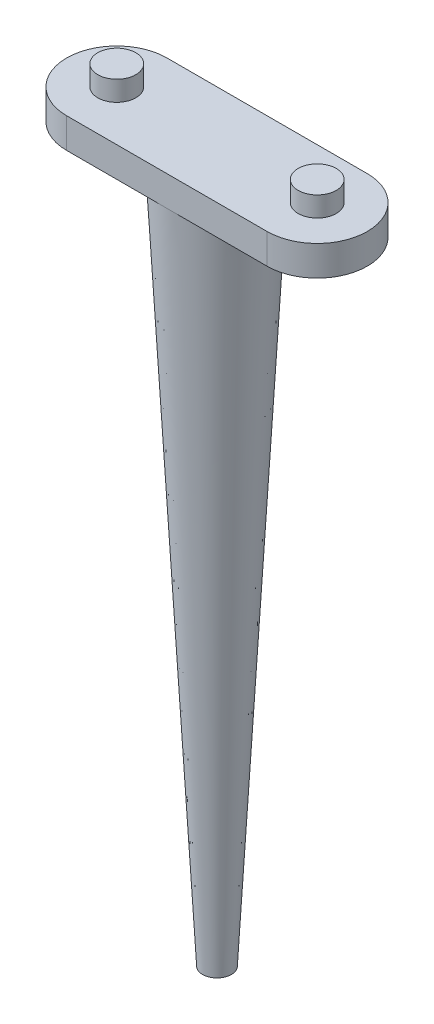
ISO-10303-21;
HEADER;
FILE_DESCRIPTION(('STEP AP214'),'2;1');
FILE_NAME('part.step','',(''),(''),'','','');
FILE_SCHEMA(('AUTOMOTIVE_DESIGN { 1 0 10303 214 1 1 1 1 }'));
ENDSEC;
DATA;
#1=APPLICATION_CONTEXT('core data for automotive mechanical design processes');
#2=APPLICATION_PROTOCOL_DEFINITION('international standard','automotive_design',2000,#1);
#3=PRODUCT_CONTEXT('',#1,'mechanical');
#4=PRODUCT('Part','Part','',(#3));
#5=PRODUCT_RELATED_PRODUCT_CATEGORY('part','',(#4));
#6=PRODUCT_DEFINITION_FORMATION('','',#4);
#7=PRODUCT_DEFINITION_CONTEXT('part definition',#1,'design');
#8=PRODUCT_DEFINITION('design','',#6,#7);
#9=PRODUCT_DEFINITION_SHAPE('','',#8);
#10=(LENGTH_UNIT() NAMED_UNIT(*) SI_UNIT(.MILLI.,.METRE.));
#11=(NAMED_UNIT(*) PLANE_ANGLE_UNIT() SI_UNIT($,.RADIAN.));
#12=(NAMED_UNIT(*) SI_UNIT($,.STERADIAN.) SOLID_ANGLE_UNIT());
#13=UNCERTAINTY_MEASURE_WITH_UNIT(LENGTH_MEASURE(1.E-05),#10,'distance_accuracy_value','');
#14=(GEOMETRIC_REPRESENTATION_CONTEXT(3) GLOBAL_UNCERTAINTY_ASSIGNED_CONTEXT((#13)) GLOBAL_UNIT_ASSIGNED_CONTEXT((#10,
#11,#12)) REPRESENTATION_CONTEXT('',''));
#15=CARTESIAN_POINT('',(0.,0.,0.));
#16=DIRECTION('',(0.,0.,1.));
#17=DIRECTION('',(1.,0.,0.));
#18=AXIS2_PLACEMENT_3D('',#15,#16,#17);
#19=CARTESIAN_POINT('',(-5.,0.,0.));
#20=DIRECTION('',(0.,1.,0.));
#21=DIRECTION('',(0.,0.,1.));
#22=AXIS2_PLACEMENT_3D('',#19,#20,#21);
#23=PLANE('',#22);
#24=CARTESIAN_POINT('',(0.,0.,0.));
#25=DIRECTION('',(0.,-1.,0.));
#26=DIRECTION('',(0.,0.,-1.));
#27=AXIS2_PLACEMENT_3D('',#24,#25,#26);
#28=CIRCLE('',#27,2.5);
#29=CARTESIAN_POINT('',(0.,0.,-2.5));
#30=VERTEX_POINT('',#29);
#31=CARTESIAN_POINT('',(0.,0.,2.5));
#32=VERTEX_POINT('',#31);
#33=EDGE_CURVE('E141',#30,#32,#28,.T.);
#34=ORIENTED_EDGE('',*,*,#33,.F.);
#35=DIRECTION('',(-1.,0.,0.));
#36=VECTOR('',#35,1.);
#37=CARTESIAN_POINT('',(-5.,0.,-2.5));
#38=LINE('',#37,#36);
#39=CARTESIAN_POINT('',(5.,0.,-2.5));
#40=VERTEX_POINT('',#39);
#41=EDGE_CURVE('E126',#40,#30,#38,.T.);
#42=ORIENTED_EDGE('',*,*,#41,.F.);
#43=CARTESIAN_POINT('',(5.,0.,0.));
#44=DIRECTION('',(0.,1.,0.));
#45=DIRECTION('',(0.,0.,1.));
#46=AXIS2_PLACEMENT_3D('',#43,#44,#45);
#47=CIRCLE('',#46,2.5);
#48=CARTESIAN_POINT('',(5.,0.,2.5));
#49=VERTEX_POINT('',#48);
#50=EDGE_CURVE('E143',#49,#40,#47,.T.);
#51=ORIENTED_EDGE('',*,*,#50,.F.);
#52=DIRECTION('',(1.,0.,0.));
#53=VECTOR('',#52,1.);
#54=CARTESIAN_POINT('',(-5.,0.,2.5));
#55=LINE('',#54,#53);
#56=EDGE_CURVE('E145',#32,#49,#55,.T.);
#57=ORIENTED_EDGE('',*,*,#56,.F.);
#58=EDGE_LOOP('',(#34,#42,#51,#57));
#59=FACE_BOUND('',#58,.T.);
#60=ADVANCED_FACE('F37',(#59),#23,.F.);
#61=CARTESIAN_POINT('',(-5.,1.5,0.));
#62=DIRECTION('',(0.,-1.,0.));
#63=DIRECTION('',(0.,0.,-1.));
#64=AXIS2_PLACEMENT_3D('',#61,#62,#63);
#65=CYLINDRICAL_SURFACE('',#64,2.5);
#66=CARTESIAN_POINT('',(-5.,0.,0.));
#67=DIRECTION('',(0.,1.,0.));
#68=DIRECTION('',(0.,0.,1.));
#69=AXIS2_PLACEMENT_3D('',#66,#67,#68);
#70=CIRCLE('',#69,2.5);
#71=CARTESIAN_POINT('',(-5.,0.,-2.5));
#72=VERTEX_POINT('',#71);
#73=CARTESIAN_POINT('',(-5.,0.,2.5));
#74=VERTEX_POINT('',#73);
#75=EDGE_CURVE('E137',#72,#74,#70,.T.);
#76=ORIENTED_EDGE('',*,*,#75,.T.);
#77=DIRECTION('',(0.,-1.,0.));
#78=VECTOR('',#77,1.);
#79=CARTESIAN_POINT('',(-5.,1.5,2.5));
#80=LINE('',#79,#78);
#81=CARTESIAN_POINT('',(-5.,1.5,2.5));
#82=VERTEX_POINT('',#81);
#83=EDGE_CURVE('E151',#82,#74,#80,.T.);
#84=ORIENTED_EDGE('',*,*,#83,.F.);
#85=CARTESIAN_POINT('',(-5.,1.5,0.));
#86=DIRECTION('',(0.,1.,0.));
#87=DIRECTION('',(0.,0.,1.));
#88=AXIS2_PLACEMENT_3D('',#85,#86,#87);
#89=CIRCLE('',#88,2.5);
#90=CARTESIAN_POINT('',(-5.,1.5,-2.5));
#91=VERTEX_POINT('',#90);
#92=EDGE_CURVE('E131',#91,#82,#89,.T.);
#93=ORIENTED_EDGE('',*,*,#92,.F.);
#94=DIRECTION('',(0.,-1.,0.));
#95=VECTOR('',#94,1.);
#96=CARTESIAN_POINT('',(-5.,1.5,-2.5));
#97=LINE('',#96,#95);
#98=EDGE_CURVE('E167',#91,#72,#97,.T.);
#99=ORIENTED_EDGE('',*,*,#98,.T.);
#100=EDGE_LOOP('',(#76,#84,#93,#99));
#101=FACE_BOUND('',#100,.T.);
#102=ADVANCED_FACE('F191',(#101),#65,.T.);
#103=CARTESIAN_POINT('',(-5.,1.5,2.5));
#104=DIRECTION('',(0.,0.,-1.));
#105=DIRECTION('',(-1.,0.,0.));
#106=AXIS2_PLACEMENT_3D('',#103,#104,#105);
#107=PLANE('',#106);
#108=EDGE_CURVE('E169',#74,#32,#55,.T.);
#109=ORIENTED_EDGE('',*,*,#108,.T.);
#110=ORIENTED_EDGE('',*,*,#56,.T.);
#111=DIRECTION('',(0.,-1.,0.));
#112=VECTOR('',#111,1.);
#113=CARTESIAN_POINT('',(5.,1.5,2.5));
#114=LINE('',#113,#112);
#115=CARTESIAN_POINT('',(5.,1.5,2.5));
#116=VERTEX_POINT('',#115);
#117=EDGE_CURVE('E153',#116,#49,#114,.T.);
#118=ORIENTED_EDGE('',*,*,#117,.F.);
#119=DIRECTION('',(1.,0.,0.));
#120=VECTOR('',#119,1.);
#121=CARTESIAN_POINT('',(-5.,1.5,2.5));
#122=LINE('',#121,#120);
#123=EDGE_CURVE('E123',#82,#116,#122,.T.);
#124=ORIENTED_EDGE('',*,*,#123,.F.);
#125=ORIENTED_EDGE('',*,*,#83,.T.);
#126=EDGE_LOOP('',(#109,#110,#118,#124,#125));
#127=FACE_BOUND('',#126,.T.);
#128=ADVANCED_FACE('F319',(#127),#107,.F.);
#129=CARTESIAN_POINT('',(5.,1.5,0.));
#130=DIRECTION('',(0.,-1.,0.));
#131=DIRECTION('',(0.,0.,-1.));
#132=AXIS2_PLACEMENT_3D('',#129,#130,#131);
#133=CYLINDRICAL_SURFACE('',#132,2.5);
#134=ORIENTED_EDGE('',*,*,#50,.T.);
#135=DIRECTION('',(0.,-1.,0.));
#136=VECTOR('',#135,1.);
#137=CARTESIAN_POINT('',(5.,1.5,-2.5));
#138=LINE('',#137,#136);
#139=CARTESIAN_POINT('',(5.,1.5,-2.5));
#140=VERTEX_POINT('',#139);
#141=EDGE_CURVE('E133',#140,#40,#138,.T.);
#142=ORIENTED_EDGE('',*,*,#141,.F.);
#143=CARTESIAN_POINT('',(5.,1.5,0.));
#144=DIRECTION('',(0.,1.,0.));
#145=DIRECTION('',(0.,0.,1.));
#146=AXIS2_PLACEMENT_3D('',#143,#144,#145);
#147=CIRCLE('',#146,2.5);
#148=EDGE_CURVE('E162',#116,#140,#147,.T.);
#149=ORIENTED_EDGE('',*,*,#148,.F.);
#150=ORIENTED_EDGE('',*,*,#117,.T.);
#151=EDGE_LOOP('',(#134,#142,#149,#150));
#152=FACE_BOUND('',#151,.T.);
#153=ADVANCED_FACE('F311',(#152),#133,.T.);
#154=CARTESIAN_POINT('',(-5.,1.5,-2.5));
#155=DIRECTION('',(0.,0.,1.));
#156=DIRECTION('',(1.,0.,0.));
#157=AXIS2_PLACEMENT_3D('',#154,#155,#156);
#158=PLANE('',#157);
#159=ORIENTED_EDGE('',*,*,#41,.T.);
#160=EDGE_CURVE('E118',#30,#72,#38,.T.);
#161=ORIENTED_EDGE('',*,*,#160,.T.);
#162=ORIENTED_EDGE('',*,*,#98,.F.);
#163=DIRECTION('',(-1.,0.,0.));
#164=VECTOR('',#163,1.);
#165=CARTESIAN_POINT('',(-5.,1.5,-2.5));
#166=LINE('',#165,#164);
#167=EDGE_CURVE('E100',#140,#91,#166,.T.);
#168=ORIENTED_EDGE('',*,*,#167,.F.);
#169=ORIENTED_EDGE('',*,*,#141,.T.);
#170=EDGE_LOOP('',(#159,#161,#162,#168,#169));
#171=FACE_BOUND('',#170,.T.);
#172=ADVANCED_FACE('F129',(#171),#158,.F.);
#173=CARTESIAN_POINT('',(-5.,1.5,0.));
#174=DIRECTION('',(0.,1.,0.));
#175=DIRECTION('',(0.,0.,1.));
#176=AXIS2_PLACEMENT_3D('',#173,#174,#175);
#177=PLANE('',#176);
#178=CARTESIAN_POINT('',(-5.,1.5,0.));
#179=DIRECTION('',(0.,1.,0.));
#180=DIRECTION('',(0.,0.,1.));
#181=AXIS2_PLACEMENT_3D('',#178,#179,#180);
#182=CIRCLE('',#181,0.95);
#183=CARTESIAN_POINT('',(-5.,1.5,0.95));
#184=VERTEX_POINT('',#183);
#185=EDGE_CURVE('E11',#184,#184,#182,.T.);
#186=ORIENTED_EDGE('',*,*,#185,.F.);
#187=EDGE_LOOP('',(#186));
#188=FACE_BOUND('',#187,.T.);
#189=CARTESIAN_POINT('',(5.,1.5,0.));
#190=DIRECTION('',(0.,1.,0.));
#191=DIRECTION('',(0.,0.,1.));
#192=AXIS2_PLACEMENT_3D('',#189,#190,#191);
#193=CIRCLE('',#192,0.95);
#194=CARTESIAN_POINT('',(5.,1.5,0.95));
#195=VERTEX_POINT('',#194);
#196=EDGE_CURVE('E60',#195,#195,#193,.T.);
#197=ORIENTED_EDGE('',*,*,#196,.F.);
#198=EDGE_LOOP('',(#197));
#199=FACE_BOUND('',#198,.T.);
#200=ORIENTED_EDGE('',*,*,#92,.T.);
#201=ORIENTED_EDGE('',*,*,#123,.T.);
#202=ORIENTED_EDGE('',*,*,#148,.T.);
#203=ORIENTED_EDGE('',*,*,#167,.T.);
#204=EDGE_LOOP('',(#200,#201,#202,#203));
#205=FACE_BOUND('',#204,.T.);
#206=ADVANCED_FACE('F215',(#188,#199,#205),#177,.T.);
#207=EDGE_CURVE('E86',#32,#30,#28,.T.);
#208=ORIENTED_EDGE('',*,*,#207,.F.);
#209=ORIENTED_EDGE('',*,*,#108,.F.);
#210=ORIENTED_EDGE('',*,*,#75,.F.);
#211=ORIENTED_EDGE('',*,*,#160,.F.);
#212=EDGE_LOOP('',(#208,#209,#210,#211));
#213=FACE_BOUND('',#212,.T.);
#214=ADVANCED_FACE('F140',(#213),#23,.F.);
#215=CARTESIAN_POINT('',(0.,0.,0.));
#216=DIRECTION('',(0.,1.,0.));
#217=DIRECTION('',(0.,0.,-1.));
#218=AXIS2_PLACEMENT_3D('',#215,#216,#217);
#219=CONICAL_SURFACE('',#218,2.5,0.0523598775598299);
#220=CARTESIAN_POINT('',(0.,-34.,0.));
#221=DIRECTION('',(0.,-1.,0.));
#222=DIRECTION('',(0.,0.,-1.));
#223=AXIS2_PLACEMENT_3D('',#220,#221,#222);
#224=CIRCLE('',#223,0.718135504376599);
#225=CARTESIAN_POINT('',(0.,-34.,-0.718135504376599));
#226=VERTEX_POINT('',#225);
#227=EDGE_CURVE('E150',#226,#226,#224,.T.);
#228=ORIENTED_EDGE('',*,*,#227,.F.);
#229=EDGE_LOOP('',(#228));
#230=FACE_BOUND('',#229,.T.);
#231=ORIENTED_EDGE('',*,*,#33,.T.);
#232=ORIENTED_EDGE('',*,*,#207,.T.);
#233=EDGE_LOOP('',(#231,#232));
#234=FACE_BOUND('',#233,.T.);
#235=ADVANCED_FACE('F147',(#230,#234),#219,.T.);
#236=CARTESIAN_POINT('',(0.,-34.,0.));
#237=DIRECTION('',(0.,-1.,0.));
#238=DIRECTION('',(0.,0.,-1.));
#239=AXIS2_PLACEMENT_3D('',#236,#237,#238);
#240=PLANE('',#239);
#241=ORIENTED_EDGE('',*,*,#227,.T.);
#242=EDGE_LOOP('',(#241));
#243=FACE_BOUND('',#242,.T.);
#244=ADVANCED_FACE('F229',(#243),#240,.T.);
#245=CARTESIAN_POINT('',(5.,2.5,0.));
#246=DIRECTION('',(0.,-1.,0.));
#247=DIRECTION('',(0.,0.,-1.));
#248=AXIS2_PLACEMENT_3D('',#245,#246,#247);
#249=CYLINDRICAL_SURFACE('',#248,0.95);
#250=CARTESIAN_POINT('',(5.,2.5,0.));
#251=DIRECTION('',(0.,1.,0.));
#252=DIRECTION('',(0.,0.,1.));
#253=AXIS2_PLACEMENT_3D('',#250,#251,#252);
#254=CIRCLE('',#253,0.95);
#255=CARTESIAN_POINT('',(5.,2.5,0.95));
#256=VERTEX_POINT('',#255);
#257=EDGE_CURVE('E160',#256,#256,#254,.T.);
#258=ORIENTED_EDGE('',*,*,#257,.F.);
#259=EDGE_LOOP('',(#258));
#260=FACE_BOUND('',#259,.T.);
#261=ORIENTED_EDGE('',*,*,#196,.T.);
#262=EDGE_LOOP('',(#261));
#263=FACE_BOUND('',#262,.T.);
#264=ADVANCED_FACE('F224',(#260,#263),#249,.T.);
#265=CARTESIAN_POINT('',(5.,2.5,0.));
#266=DIRECTION('',(0.,1.,0.));
#267=DIRECTION('',(0.,0.,1.));
#268=AXIS2_PLACEMENT_3D('',#265,#266,#267);
#269=PLANE('',#268);
#270=ORIENTED_EDGE('',*,*,#257,.T.);
#271=EDGE_LOOP('',(#270));
#272=FACE_BOUND('',#271,.T.);
#273=ADVANCED_FACE('F228',(#272),#269,.T.);
#274=CARTESIAN_POINT('',(-5.,2.5,0.));
#275=DIRECTION('',(0.,-1.,0.));
#276=DIRECTION('',(0.,0.,-1.));
#277=AXIS2_PLACEMENT_3D('',#274,#275,#276);
#278=CYLINDRICAL_SURFACE('',#277,0.95);
#279=CARTESIAN_POINT('',(-5.,2.5,0.));
#280=DIRECTION('',(0.,1.,0.));
#281=DIRECTION('',(0.,0.,1.));
#282=AXIS2_PLACEMENT_3D('',#279,#280,#281);
#283=CIRCLE('',#282,0.95);
#284=CARTESIAN_POINT('',(-5.,2.5,0.95));
#285=VERTEX_POINT('',#284);
#286=EDGE_CURVE('E146',#285,#285,#283,.T.);
#287=ORIENTED_EDGE('',*,*,#286,.F.);
#288=EDGE_LOOP('',(#287));
#289=FACE_BOUND('',#288,.T.);
#290=ORIENTED_EDGE('',*,*,#185,.T.);
#291=EDGE_LOOP('',(#290));
#292=FACE_BOUND('',#291,.T.);
#293=ADVANCED_FACE('F237',(#289,#292),#278,.T.);
#294=CARTESIAN_POINT('',(-5.,2.5,0.));
#295=DIRECTION('',(0.,1.,0.));
#296=DIRECTION('',(0.,0.,1.));
#297=AXIS2_PLACEMENT_3D('',#294,#295,#296);
#298=PLANE('',#297);
#299=ORIENTED_EDGE('',*,*,#286,.T.);
#300=EDGE_LOOP('',(#299));
#301=FACE_BOUND('',#300,.T.);
#302=ADVANCED_FACE('F241',(#301),#298,.T.);
#303=CLOSED_SHELL('',(#60,#102,#128,#153,#172,#206,#214,#235,#244,#264,#273,#293,#302));
#304=CARTESIAN_POINT('',(-5.,1.5,1.5));
#305=DIRECTION('',(0.,0.,-1.));
#306=DIRECTION('',(-1.,0.,0.));
#307=AXIS2_PLACEMENT_3D('',#304,#305,#306);
#308=PLANE('',#307);
#309=CARTESIAN_POINT('',(0.39460222415233,1.,1.5));
#310=CARTESIAN_POINT('',(0.382554967217705,0.941728306608441,1.5));
#311=CARTESIAN_POINT('',(0.37008946368021,0.883527071336524,1.5));
#312=CARTESIAN_POINT('',(0.343789689428615,0.767228167977039,1.5));
#313=CARTESIAN_POINT('',(0.329950899123669,0.709131528671573,1.5));
#314=CARTESIAN_POINT('',(0.300053664201747,0.591858159980954,1.5));
#315=CARTESIAN_POINT('',(0.283945802842418,0.532694032626076,1.5));
#316=CARTESIAN_POINT('',(0.24880510405071,0.415284404493704,1.5));
#317=CARTESIAN_POINT('',(0.229777199668599,0.357037533785651,1.5));
#318=CARTESIAN_POINT('',(0.197128074684721,0.271601163049664,1.5));
#319=CARTESIAN_POINT('',(0.185638705080724,0.243601482643785,1.5));
#320=CARTESIAN_POINT('',(0.160498730554625,0.188532752943431,1.5));
#321=CARTESIAN_POINT('',(0.146849257223928,0.16146322536625,1.5));
#322=CARTESIAN_POINT('',(0.123400181976904,0.122501706394803,1.5));
#323=CARTESIAN_POINT('',(0.115052523033316,0.109745400673179,1.5));
#324=CARTESIAN_POINT('',(0.09690981062714,0.0853282471859353,1.5));
#325=CARTESIAN_POINT('',(0.0871225321553441,0.073662033653641,1.5));
#326=CARTESIAN_POINT('',(0.0718311763154875,0.0588659959418735,1.5));
#327=CARTESIAN_POINT('',(0.067251341825362,0.0547928242190261,1.5));
#328=CARTESIAN_POINT('',(0.0576538863954024,0.0471726744770644,1.5));
#329=CARTESIAN_POINT('',(0.0526356671254885,0.0436264340369817,1.5));
#330=CARTESIAN_POINT('',(0.0420491149743679,0.0372493568539903,1.5));
#331=CARTESIAN_POINT('',(0.0364737569187843,0.0344298495045838,1.5));
#332=CARTESIAN_POINT('',(0.0248884036461667,0.0299151450520305,1.5));
#333=CARTESIAN_POINT('',(0.0188802234925099,0.0282155250070988,1.5));
#334=CARTESIAN_POINT('',(0.00828324632994077,0.0264943750545445,1.5));
#335=CARTESIAN_POINT('',(0.00374757623157232,0.0261443480422943,1.5));
#336=CARTESIAN_POINT('',(-0.0053170844921082,0.0262353290672694,1.5));
#337=CARTESIAN_POINT('',(-0.00984607417568981,0.0266764396173257,1.5));
#338=CARTESIAN_POINT('',(-0.0187448096228824,0.0282949547247752,1.5));
#339=CARTESIAN_POINT('',(-0.0231151945070126,0.0294689476703472,1.5));
#340=CARTESIAN_POINT('',(-0.0316379919768563,0.0324360277985676,1.5));
#341=CARTESIAN_POINT('',(-0.0357902422207728,0.0342295687516708,1.5));
#342=CARTESIAN_POINT('',(-0.0466978739162957,0.0397508377963844,1.5));
#343=CARTESIAN_POINT('',(-0.0532134134727819,0.0439486581997328,1.5));
#344=CARTESIAN_POINT('',(-0.0655512070837475,0.0532623107104461,1.5));
#345=CARTESIAN_POINT('',(-0.0713709350178814,0.0583813282460795,1.5));
#346=CARTESIAN_POINT('',(-0.0915125361514529,0.0780262661622011,1.5));
#347=CARTESIAN_POINT('',(-0.104154907054087,0.0942321169363347,1.5));
#348=CARTESIAN_POINT('',(-0.127227518419018,0.128147942019241,1.5));
#349=CARTESIAN_POINT('',(-0.137641278549376,0.145867851519888,1.5));
#350=CARTESIAN_POINT('',(-0.166917367015354,0.200396763316049,1.5));
#351=CARTESIAN_POINT('',(-0.183642293599232,0.238346735855308,1.5));
#352=CARTESIAN_POINT('',(-0.214278724930122,0.315384637106884,1.5));
#353=CARTESIAN_POINT('',(-0.228181696526852,0.354475620114585,1.5));
#354=CARTESIAN_POINT('',(-0.267261558982651,0.472689188328078,1.5));
#355=CARTESIAN_POINT('',(-0.289782976824788,0.552691404804508,1.5));
#356=CARTESIAN_POINT('',(-0.326289132451878,0.694134758109007,1.5));
#357=CARTESIAN_POINT('',(-0.341022895113506,0.755400363804789,1.5));
#358=CARTESIAN_POINT('',(-0.368858734364118,0.87774389189,1.5));
#359=CARTESIAN_POINT('',(-0.381973871125921,0.938818822877985,1.5));
#360=CARTESIAN_POINT('',(-0.394602224152329,1.,1.5));
#361=B_SPLINE_CURVE_WITH_KNOTS('',3,(#309,#310,#311,#312,#313,#314,#315,#316,#317,#318,#319,
#320,#321,#322,#323,#324,#325,#326,#327,#328,#329,#330,#331,#332,#333,#334,#335,#336,#337,#338,
#339,#340,#341,#342,#343,#344,#345,#346,#347,#348,#349,#350,#351,#352,#353,#354,#355,#356,#357,
#358,#359,#360),.UNSPECIFIED.,.F.,.F.,(4,2,2,2,2,2,2,2,2,2,2,2,2,2,2,2,2,2,2,2,2,2,2,2,2,4),(0.,
0.178536362187886,0.357681122402261,0.541611166166297,0.725233835768844,0.815999083731081,
0.906716939875595,0.952406080493795,0.997856958092644,1.01621644839051,1.03460140031341,
1.05325765717239,1.07183978320201,1.08542144180195,1.09900486039274,1.1125255140811,
1.12605609166165,1.14917244808864,1.17237033124028,1.23354751839106,1.29516256444036,
1.41924001123748,1.54368723562422,1.79278030335756,1.98181526793238,2.16920841772995),.UNSPECIFIED.);
#362=CARTESIAN_POINT('',(0.274064292622238,0.5,1.5));
#363=VERTEX_POINT('',#362);
#364=CARTESIAN_POINT('',(-0.274064292622237,0.5,1.5));
#365=VERTEX_POINT('',#364);
#366=EDGE_CURVE('E179',#363,#365,#361,.T.);
#367=ORIENTED_EDGE('',*,*,#366,.T.);
#368=DIRECTION('',(1.,0.,0.));
#369=VECTOR('',#368,1.);
#370=CARTESIAN_POINT('',(-5.,0.5,1.5));
#371=LINE('',#370,#369);
#372=EDGE_CURVE('E155',#365,#363,#371,.T.);
#373=ORIENTED_EDGE('',*,*,#372,.T.);
#374=EDGE_LOOP('',(#367,#373));
#375=FACE_BOUND('',#374,.T.);
#376=ADVANCED_FACE('F183',(#375),#308,.T.);
#377=CARTESIAN_POINT('',(-5.,1.5,-1.5));
#378=DIRECTION('',(0.,0.,1.));
#379=DIRECTION('',(1.,0.,0.));
#380=AXIS2_PLACEMENT_3D('',#377,#378,#379);
#381=PLANE('',#380);
#382=CARTESIAN_POINT('',(0.394602224152323,1.,-1.5));
#383=CARTESIAN_POINT('',(0.382554967217699,0.941728306608449,-1.5));
#384=CARTESIAN_POINT('',(0.370089463680206,0.88352707133654,-1.5));
#385=CARTESIAN_POINT('',(0.343789689428615,0.76722816797707,-1.5));
#386=CARTESIAN_POINT('',(0.329950899123671,0.709131528671612,-1.5));
#387=CARTESIAN_POINT('',(0.300053664201752,0.591858159981005,-1.5));
#388=CARTESIAN_POINT('',(0.283945802842423,0.53269403262613,-1.5));
#389=CARTESIAN_POINT('',(0.248805104050718,0.415284404493766,-1.5));
#390=CARTESIAN_POINT('',(0.229777199668611,0.357037533785716,-1.5));
#391=CARTESIAN_POINT('',(0.197128074684737,0.271601163049736,-1.5));
#392=CARTESIAN_POINT('',(0.185638705080742,0.243601482643859,-1.5));
#393=CARTESIAN_POINT('',(0.160498730554648,0.188532752943509,-1.5));
#394=CARTESIAN_POINT('',(0.146849257223954,0.161463225366331,-1.5));
#395=CARTESIAN_POINT('',(0.123400181976936,0.122501706394887,-1.5));
#396=CARTESIAN_POINT('',(0.11505252303335,0.109745400673264,-1.5));
#397=CARTESIAN_POINT('',(0.0969098106271799,0.0853282471860198,-1.5));
#398=CARTESIAN_POINT('',(0.0871225321553879,0.073662033653724,-1.5));
#399=CARTESIAN_POINT('',(0.0718311763155334,0.0588659959419512,-1.5));
#400=CARTESIAN_POINT('',(0.067251341825406,0.0547928242191003,-1.5));
#401=CARTESIAN_POINT('',(0.057653886395444,0.0471726744771296,-1.5));
#402=CARTESIAN_POINT('',(0.0526356671255297,0.0436264340370414,-1.5));
#403=CARTESIAN_POINT('',(0.0420491149744056,0.0372493568540413,-1.5));
#404=CARTESIAN_POINT('',(0.0364737569188189,0.0344298495046318,-1.5));
#405=CARTESIAN_POINT('',(0.0248884036461949,0.0299151450520738,-1.5));
#406=CARTESIAN_POINT('',(0.0188802234925347,0.0282155250071403,-1.5));
#407=CARTESIAN_POINT('',(0.00828324632996214,0.0264943750545792,-1.5));
#408=CARTESIAN_POINT('',(0.00374757623159378,0.0261443480423246,-1.5));
#409=CARTESIAN_POINT('',(-0.00531708449208646,0.026235329067297,-1.5));
#410=CARTESIAN_POINT('',(-0.00984607417566789,0.0266764396173551,-1.5));
#411=CARTESIAN_POINT('',(-0.018744809622861,0.0282949547248036,-1.5));
#412=CARTESIAN_POINT('',(-0.0231151945069919,0.029468947670373,-1.5));
#413=CARTESIAN_POINT('',(-0.031637991976836,0.0324360277985914,-1.5));
#414=CARTESIAN_POINT('',(-0.0357902422207523,0.0342295687516954,-1.5));
#415=CARTESIAN_POINT('',(-0.0466978739162731,0.0397508377964067,-1.5));
#416=CARTESIAN_POINT('',(-0.0532134134727585,0.0439486581997497,-1.5));
#417=CARTESIAN_POINT('',(-0.0655512070837215,0.0532623107104549,-1.5));
#418=CARTESIAN_POINT('',(-0.0713709350178534,0.0583813282460855,-1.5));
#419=CARTESIAN_POINT('',(-0.0915125361514148,0.0780262661621915,-1.5));
#420=CARTESIAN_POINT('',(-0.104154907054044,0.0942321169363094,-1.5));
#421=CARTESIAN_POINT('',(-0.127227518418966,0.128147942019186,-1.5));
#422=CARTESIAN_POINT('',(-0.137641278549319,0.145867851519819,-1.5));
#423=CARTESIAN_POINT('',(-0.166917367015277,0.200396763315924,-1.5));
#424=CARTESIAN_POINT('',(-0.183642293599144,0.238346735855139,-1.5));
#425=CARTESIAN_POINT('',(-0.214278724930014,0.315384637106627,-1.5));
#426=CARTESIAN_POINT('',(-0.228181696526736,0.354475620114282,-1.5));
#427=CARTESIAN_POINT('',(-0.267261558982512,0.47268918832764,-1.5));
#428=CARTESIAN_POINT('',(-0.289782976824635,0.552691404803981,-1.5));
#429=CARTESIAN_POINT('',(-0.326289132451745,0.694134758108493,-1.5));
#430=CARTESIAN_POINT('',(-0.341022895113403,0.755400363804378,-1.5));
#431=CARTESIAN_POINT('',(-0.368858734364066,0.877743891889794,-1.5));
#432=CARTESIAN_POINT('',(-0.381973871125893,0.938818822877882,-1.5));
#433=CARTESIAN_POINT('',(-0.394602224152324,1.,-1.5));
#434=B_SPLINE_CURVE_WITH_KNOTS('',3,(#382,#383,#384,#385,#386,#387,#388,#389,#390,#391,#392,
#393,#394,#395,#396,#397,#398,#399,#400,#401,#402,#403,#404,#405,#406,#407,#408,#409,#410,#411,
#412,#413,#414,#415,#416,#417,#418,#419,#420,#421,#422,#423,#424,#425,#426,#427,#428,#429,#430,
#431,#432,#433),.UNSPECIFIED.,.F.,.F.,(4,2,2,2,2,2,2,2,2,2,2,2,2,2,2,2,2,2,2,2,2,2,2,2,2,4),(0.,
0.178536362187862,0.357681122402214,0.541611166166237,0.725233835768771,0.815999083731,
0.906716939875503,0.952406080493698,0.997856958092542,1.01621644839042,1.03460140031333,
1.05325765717232,1.07183978320195,1.0854214418019,1.09900486039268,1.11252551408104,
1.12605609166159,1.14917244808857,1.1723703312402,1.23354751839094,1.2951625644402,
1.41924001123719,1.54368723562378,1.79278030335686,1.981815267932,2.16920841772988),.UNSPECIFIED.);
#435=CARTESIAN_POINT('',(0.274064292622228,0.5,-1.5));
#436=VERTEX_POINT('',#435);
#437=CARTESIAN_POINT('',(-0.274064292622228,0.5,-1.5));
#438=VERTEX_POINT('',#437);
#439=EDGE_CURVE('E44',#436,#438,#434,.T.);
#440=ORIENTED_EDGE('',*,*,#439,.F.);
#441=DIRECTION('',(-1.,0.,0.));
#442=VECTOR('',#441,1.);
#443=CARTESIAN_POINT('',(-5.,0.5,-1.5));
#444=LINE('',#443,#442);
#445=EDGE_CURVE('E184',#436,#438,#444,.T.);
#446=ORIENTED_EDGE('',*,*,#445,.T.);
#447=EDGE_LOOP('',(#440,#446));
#448=FACE_BOUND('',#447,.T.);
#449=ADVANCED_FACE('F190',(#448),#381,.T.);
#450=CARTESIAN_POINT('',(-5.,0.5,0.));
#451=DIRECTION('',(0.,1.,0.));
#452=DIRECTION('',(0.,0.,1.));
#453=AXIS2_PLACEMENT_3D('',#450,#451,#452);
#454=PLANE('',#453);
#455=CARTESIAN_POINT('',(0.,0.5,0.));
#456=DIRECTION('',(0.,1.,0.));
#457=DIRECTION('',(0.,0.,1.));
#458=AXIS2_PLACEMENT_3D('',#455,#456,#457);
#459=CIRCLE('',#458,1.5248315436436);
#460=EDGE_CURVE('E84',#365,#438,#459,.F.);
#461=ORIENTED_EDGE('',*,*,#460,.T.);
#462=ORIENTED_EDGE('',*,*,#445,.F.);
#463=EDGE_CURVE('E69',#436,#363,#459,.F.);
#464=ORIENTED_EDGE('',*,*,#463,.T.);
#465=ORIENTED_EDGE('',*,*,#372,.F.);
#466=EDGE_LOOP('',(#461,#462,#464,#465));
#467=FACE_BOUND('',#466,.T.);
#468=ADVANCED_FACE('F198',(#467),#454,.F.);
#469=CARTESIAN_POINT('',(0.,0.0523359562429439,0.));
#470=DIRECTION('',(0.,1.,0.));
#471=DIRECTION('',(0.,0.,-1.));
#472=AXIS2_PLACEMENT_3D('',#469,#470,#471);
#473=CONICAL_SURFACE('',#472,1.50137046524543,0.0523598775598299);
#474=CARTESIAN_POINT('',(0.,-28.5955191100231,0.));
#475=VERTEX_POINT('',#474);
#476=VERTEX_LOOP('',#475);
#477=FACE_BOUND('',#476,.T.);
#478=ORIENTED_EDGE('',*,*,#366,.F.);
#479=ORIENTED_EDGE('',*,*,#463,.F.);
#480=ORIENTED_EDGE('',*,*,#439,.T.);
#481=ORIENTED_EDGE('',*,*,#460,.F.);
#482=EDGE_LOOP('',(#478,#479,#480,#481));
#483=FACE_BOUND('',#482,.T.);
#484=ADVANCED_FACE('F45',(#477,#483),#473,.F.);
#485=CLOSED_SHELL('',(#376,#449,#468,#484));
#486=ORIENTED_CLOSED_SHELL('',*,#303,.T.);
#487=BREP_WITH_VOIDS('B2',#485,(#486));
#488=ADVANCED_BREP_SHAPE_REPRESENTATION('',(#18,#487),#14);
#489=SHAPE_DEFINITION_REPRESENTATION(#9,#488);
ENDSEC;
END-ISO-10303-21;
